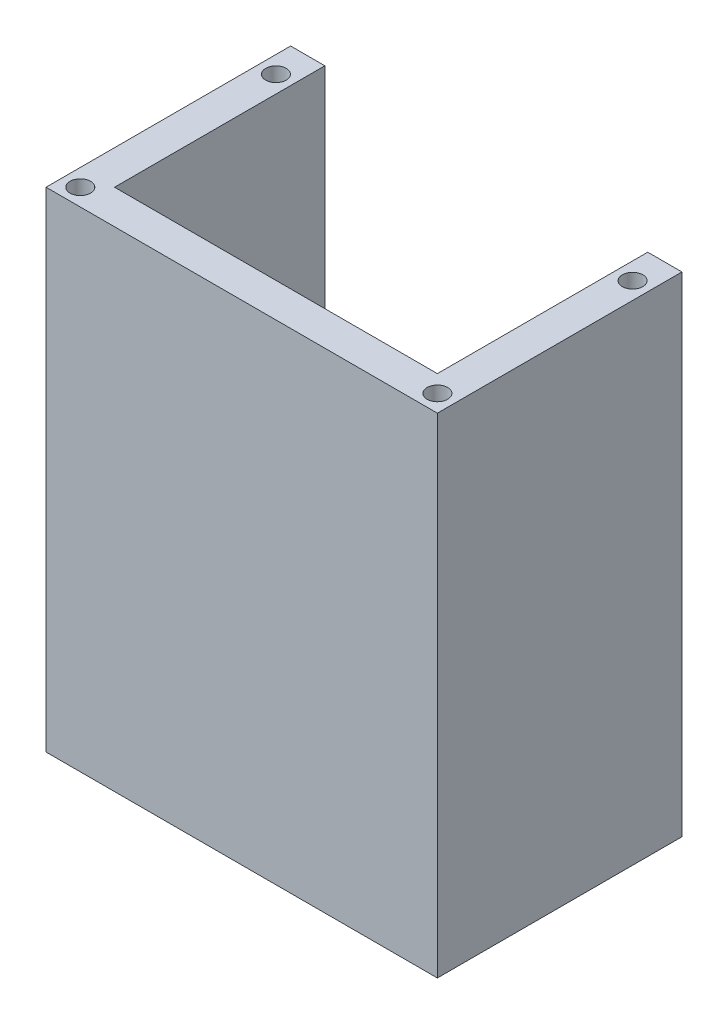
ISO-10303-21;
HEADER;
FILE_DESCRIPTION(('STEP AP214'),'2;1');
FILE_NAME('part.step','',(''),(''),'','','');
FILE_SCHEMA(('AUTOMOTIVE_DESIGN { 1 0 10303 214 1 1 1 1 }'));
ENDSEC;
DATA;
#1=APPLICATION_CONTEXT('core data for automotive mechanical design processes');
#2=APPLICATION_PROTOCOL_DEFINITION('international standard','automotive_design',2000,#1);
#3=PRODUCT_CONTEXT('',#1,'mechanical');
#4=PRODUCT('Part','Part','',(#3));
#5=PRODUCT_RELATED_PRODUCT_CATEGORY('part','',(#4));
#6=PRODUCT_DEFINITION_FORMATION('','',#4);
#7=PRODUCT_DEFINITION_CONTEXT('part definition',#1,'design');
#8=PRODUCT_DEFINITION('design','',#6,#7);
#9=PRODUCT_DEFINITION_SHAPE('','',#8);
#10=(LENGTH_UNIT() NAMED_UNIT(*) SI_UNIT(.MILLI.,.METRE.));
#11=(NAMED_UNIT(*) PLANE_ANGLE_UNIT() SI_UNIT($,.RADIAN.));
#12=(NAMED_UNIT(*) SI_UNIT($,.STERADIAN.) SOLID_ANGLE_UNIT());
#13=UNCERTAINTY_MEASURE_WITH_UNIT(LENGTH_MEASURE(1.E-05),#10,'distance_accuracy_value','');
#14=(GEOMETRIC_REPRESENTATION_CONTEXT(3) GLOBAL_UNCERTAINTY_ASSIGNED_CONTEXT((#13)) GLOBAL_UNIT_ASSIGNED_CONTEXT((#10,
#11,#12)) REPRESENTATION_CONTEXT('',''));
#15=CARTESIAN_POINT('',(0.,0.,0.));
#16=DIRECTION('',(0.,0.,1.));
#17=DIRECTION('',(1.,0.,0.));
#18=AXIS2_PLACEMENT_3D('',#15,#16,#17);
#19=CARTESIAN_POINT('',(0.,100.,-50.));
#20=DIRECTION('',(0.,0.,1.));
#21=DIRECTION('',(1.,0.,0.));
#22=AXIS2_PLACEMENT_3D('',#19,#20,#21);
#23=PLANE('',#22);
#24=DIRECTION('',(0.,1.,0.));
#25=VECTOR('',#24,1.);
#26=CARTESIAN_POINT('',(7.,100.,-50.));
#27=LINE('',#26,#25);
#28=CARTESIAN_POINT('',(7.,0.,-50.));
#29=VERTEX_POINT('',#28);
#30=CARTESIAN_POINT('',(7.,100.,-50.));
#31=VERTEX_POINT('',#30);
#32=EDGE_CURVE('E112',#29,#31,#27,.T.);
#33=ORIENTED_EDGE('',*,*,#32,.F.);
#34=DIRECTION('',(-1.,0.,0.));
#35=VECTOR('',#34,1.);
#36=CARTESIAN_POINT('',(0.,0.,-50.));
#37=LINE('',#36,#35);
#38=CARTESIAN_POINT('',(0.,0.,-50.));
#39=VERTEX_POINT('',#38);
#40=EDGE_CURVE('E78',#29,#39,#37,.T.);
#41=ORIENTED_EDGE('',*,*,#40,.T.);
#42=DIRECTION('',(0.,-1.,0.));
#43=VECTOR('',#42,1.);
#44=CARTESIAN_POINT('',(0.,100.,-50.));
#45=LINE('',#44,#43);
#46=CARTESIAN_POINT('',(0.,100.,-50.));
#47=VERTEX_POINT('',#46);
#48=EDGE_CURVE('E147',#47,#39,#45,.T.);
#49=ORIENTED_EDGE('',*,*,#48,.F.);
#50=DIRECTION('',(-1.,0.,0.));
#51=VECTOR('',#50,1.);
#52=CARTESIAN_POINT('',(0.,100.,-50.));
#53=LINE('',#52,#51);
#54=EDGE_CURVE('E56',#31,#47,#53,.T.);
#55=ORIENTED_EDGE('',*,*,#54,.F.);
#56=EDGE_LOOP('',(#33,#41,#49,#55));
#57=FACE_BOUND('',#56,.T.);
#58=ADVANCED_FACE('F32',(#57),#23,.F.);
#59=DIRECTION('',(0.,-1.,0.));
#60=VECTOR('',#59,1.);
#61=CARTESIAN_POINT('',(73.,100.,-50.));
#62=LINE('',#61,#60);
#63=CARTESIAN_POINT('',(73.,100.,-50.));
#64=VERTEX_POINT('',#63);
#65=CARTESIAN_POINT('',(73.,0.,-50.));
#66=VERTEX_POINT('',#65);
#67=EDGE_CURVE('E47',#64,#66,#62,.T.);
#68=ORIENTED_EDGE('',*,*,#67,.F.);
#69=CARTESIAN_POINT('',(80.,100.,-50.));
#70=VERTEX_POINT('',#69);
#71=EDGE_CURVE('E145',#70,#64,#53,.T.);
#72=ORIENTED_EDGE('',*,*,#71,.F.);
#73=DIRECTION('',(0.,-1.,0.));
#74=VECTOR('',#73,1.);
#75=CARTESIAN_POINT('',(80.,100.,-50.));
#76=LINE('',#75,#74);
#77=CARTESIAN_POINT('',(80.,0.,-50.));
#78=VERTEX_POINT('',#77);
#79=EDGE_CURVE('E157',#70,#78,#76,.T.);
#80=ORIENTED_EDGE('',*,*,#79,.T.);
#81=EDGE_CURVE('E141',#78,#66,#37,.T.);
#82=ORIENTED_EDGE('',*,*,#81,.T.);
#83=EDGE_LOOP('',(#68,#72,#80,#82));
#84=FACE_BOUND('',#83,.T.);
#85=ADVANCED_FACE('F177',(#84),#23,.F.);
#86=CARTESIAN_POINT('',(0.,100.,0.));
#87=DIRECTION('',(0.,-1.,0.));
#88=DIRECTION('',(0.,0.,-1.));
#89=AXIS2_PLACEMENT_3D('',#86,#87,#88);
#90=PLANE('',#89);
#91=CARTESIAN_POINT('',(3.5,100.,-43.5));
#92=DIRECTION('',(0.,1.,0.));
#93=DIRECTION('',(0.,0.,1.));
#94=AXIS2_PLACEMENT_3D('',#91,#92,#93);
#95=CIRCLE('',#94,2.1);
#96=CARTESIAN_POINT('',(3.5,100.,-41.4));
#97=VERTEX_POINT('',#96);
#98=EDGE_CURVE('E215',#97,#97,#95,.T.);
#99=ORIENTED_EDGE('',*,*,#98,.F.);
#100=EDGE_LOOP('',(#99));
#101=FACE_BOUND('',#100,.T.);
#102=CARTESIAN_POINT('',(76.5,100.,-43.4));
#103=DIRECTION('',(0.,1.,0.));
#104=DIRECTION('',(0.,0.,1.));
#105=AXIS2_PLACEMENT_3D('',#102,#103,#104);
#106=CIRCLE('',#105,2.1);
#107=CARTESIAN_POINT('',(76.5,100.,-41.3));
#108=VERTEX_POINT('',#107);
#109=EDGE_CURVE('E226',#108,#108,#106,.T.);
#110=ORIENTED_EDGE('',*,*,#109,.F.);
#111=EDGE_LOOP('',(#110));
#112=FACE_BOUND('',#111,.T.);
#113=CARTESIAN_POINT('',(76.5,100.,-3.5));
#114=DIRECTION('',(0.,1.,0.));
#115=DIRECTION('',(0.,0.,1.));
#116=AXIS2_PLACEMENT_3D('',#113,#114,#115);
#117=CIRCLE('',#116,2.1);
#118=CARTESIAN_POINT('',(76.5,100.,-1.4));
#119=VERTEX_POINT('',#118);
#120=EDGE_CURVE('E222',#119,#119,#117,.T.);
#121=ORIENTED_EDGE('',*,*,#120,.F.);
#122=EDGE_LOOP('',(#121));
#123=FACE_BOUND('',#122,.T.);
#124=CARTESIAN_POINT('',(3.5,100.,-3.5));
#125=DIRECTION('',(0.,1.,0.));
#126=DIRECTION('',(0.,0.,1.));
#127=AXIS2_PLACEMENT_3D('',#124,#125,#126);
#128=CIRCLE('',#127,2.1);
#129=CARTESIAN_POINT('',(3.5,100.,-1.4));
#130=VERTEX_POINT('',#129);
#131=EDGE_CURVE('E133',#130,#130,#128,.T.);
#132=ORIENTED_EDGE('',*,*,#131,.F.);
#133=EDGE_LOOP('',(#132));
#134=FACE_BOUND('',#133,.T.);
#135=DIRECTION('',(0.,0.,1.));
#136=VECTOR('',#135,1.);
#137=CARTESIAN_POINT('',(7.,100.,-7.));
#138=LINE('',#137,#136);
#139=CARTESIAN_POINT('',(7.,100.,-7.));
#140=VERTEX_POINT('',#139);
#141=EDGE_CURVE('E108',#31,#140,#138,.T.);
#142=ORIENTED_EDGE('',*,*,#141,.F.);
#143=ORIENTED_EDGE('',*,*,#54,.T.);
#144=DIRECTION('',(0.,0.,1.));
#145=VECTOR('',#144,1.);
#146=CARTESIAN_POINT('',(0.,100.,0.));
#147=LINE('',#146,#145);
#148=CARTESIAN_POINT('',(0.,100.,0.));
#149=VERTEX_POINT('',#148);
#150=EDGE_CURVE('E139',#47,#149,#147,.T.);
#151=ORIENTED_EDGE('',*,*,#150,.T.);
#152=DIRECTION('',(1.,0.,0.));
#153=VECTOR('',#152,1.);
#154=CARTESIAN_POINT('',(0.,100.,0.));
#155=LINE('',#154,#153);
#156=CARTESIAN_POINT('',(80.,100.,0.));
#157=VERTEX_POINT('',#156);
#158=EDGE_CURVE('E86',#149,#157,#155,.T.);
#159=ORIENTED_EDGE('',*,*,#158,.T.);
#160=DIRECTION('',(0.,0.,-1.));
#161=VECTOR('',#160,1.);
#162=CARTESIAN_POINT('',(80.,100.,0.));
#163=LINE('',#162,#161);
#164=EDGE_CURVE('E143',#157,#70,#163,.T.);
#165=ORIENTED_EDGE('',*,*,#164,.T.);
#166=ORIENTED_EDGE('',*,*,#71,.T.);
#167=DIRECTION('',(0.,0.,-1.));
#168=VECTOR('',#167,1.);
#169=CARTESIAN_POINT('',(73.,100.,-7.));
#170=LINE('',#169,#168);
#171=CARTESIAN_POINT('',(73.,100.,-7.));
#172=VERTEX_POINT('',#171);
#173=EDGE_CURVE('E127',#172,#64,#170,.T.);
#174=ORIENTED_EDGE('',*,*,#173,.F.);
#175=DIRECTION('',(1.,0.,0.));
#176=VECTOR('',#175,1.);
#177=CARTESIAN_POINT('',(7.,100.,-7.));
#178=LINE('',#177,#176);
#179=EDGE_CURVE('E114',#140,#172,#178,.T.);
#180=ORIENTED_EDGE('',*,*,#179,.F.);
#181=EDGE_LOOP('',(#142,#143,#151,#159,#165,#166,#174,#180));
#182=FACE_BOUND('',#181,.T.);
#183=ADVANCED_FACE('F125',(#101,#112,#123,#134,#182),#90,.F.);
#184=CARTESIAN_POINT('',(0.,0.,0.));
#185=DIRECTION('',(0.,-1.,0.));
#186=DIRECTION('',(0.,0.,-1.));
#187=AXIS2_PLACEMENT_3D('',#184,#185,#186);
#188=PLANE('',#187);
#189=CARTESIAN_POINT('',(3.5,0.,-43.5));
#190=DIRECTION('',(0.,1.,0.));
#191=DIRECTION('',(0.,0.,1.));
#192=AXIS2_PLACEMENT_3D('',#189,#190,#191);
#193=CIRCLE('',#192,2.1);
#194=CARTESIAN_POINT('',(3.5,0.,-41.4));
#195=VERTEX_POINT('',#194);
#196=EDGE_CURVE('E202',#195,#195,#193,.T.);
#197=ORIENTED_EDGE('',*,*,#196,.T.);
#198=EDGE_LOOP('',(#197));
#199=FACE_BOUND('',#198,.T.);
#200=CARTESIAN_POINT('',(76.5,0.,-43.4));
#201=DIRECTION('',(0.,1.,0.));
#202=DIRECTION('',(0.,0.,1.));
#203=AXIS2_PLACEMENT_3D('',#200,#201,#202);
#204=CIRCLE('',#203,2.1);
#205=CARTESIAN_POINT('',(76.5,0.,-41.3));
#206=VERTEX_POINT('',#205);
#207=EDGE_CURVE('E206',#206,#206,#204,.T.);
#208=ORIENTED_EDGE('',*,*,#207,.T.);
#209=EDGE_LOOP('',(#208));
#210=FACE_BOUND('',#209,.T.);
#211=CARTESIAN_POINT('',(76.5,0.,-3.5));
#212=DIRECTION('',(0.,1.,0.));
#213=DIRECTION('',(0.,0.,1.));
#214=AXIS2_PLACEMENT_3D('',#211,#212,#213);
#215=CIRCLE('',#214,2.1);
#216=CARTESIAN_POINT('',(76.5,0.,-1.4));
#217=VERTEX_POINT('',#216);
#218=EDGE_CURVE('E210',#217,#217,#215,.T.);
#219=ORIENTED_EDGE('',*,*,#218,.T.);
#220=EDGE_LOOP('',(#219));
#221=FACE_BOUND('',#220,.T.);
#222=CARTESIAN_POINT('',(3.5,0.,-3.5));
#223=DIRECTION('',(0.,1.,0.));
#224=DIRECTION('',(0.,0.,1.));
#225=AXIS2_PLACEMENT_3D('',#222,#223,#224);
#226=CIRCLE('',#225,2.1);
#227=CARTESIAN_POINT('',(3.5,0.,-1.4));
#228=VERTEX_POINT('',#227);
#229=EDGE_CURVE('E213',#228,#228,#226,.T.);
#230=ORIENTED_EDGE('',*,*,#229,.T.);
#231=EDGE_LOOP('',(#230));
#232=FACE_BOUND('',#231,.T.);
#233=ORIENTED_EDGE('',*,*,#40,.F.);
#234=DIRECTION('',(0.,0.,1.));
#235=VECTOR('',#234,1.);
#236=CARTESIAN_POINT('',(7.,0.,0.));
#237=LINE('',#236,#235);
#238=CARTESIAN_POINT('',(7.,0.,-7.));
#239=VERTEX_POINT('',#238);
#240=EDGE_CURVE('E11',#29,#239,#237,.T.);
#241=ORIENTED_EDGE('',*,*,#240,.T.);
#242=DIRECTION('',(1.,0.,0.));
#243=VECTOR('',#242,1.);
#244=CARTESIAN_POINT('',(7.,0.,-7.));
#245=LINE('',#244,#243);
#246=CARTESIAN_POINT('',(73.,0.,-7.));
#247=VERTEX_POINT('',#246);
#248=EDGE_CURVE('E121',#239,#247,#245,.T.);
#249=ORIENTED_EDGE('',*,*,#248,.T.);
#250=DIRECTION('',(0.,0.,-1.));
#251=VECTOR('',#250,1.);
#252=CARTESIAN_POINT('',(73.,0.,-7.));
#253=LINE('',#252,#251);
#254=EDGE_CURVE('E115',#247,#66,#253,.T.);
#255=ORIENTED_EDGE('',*,*,#254,.T.);
#256=ORIENTED_EDGE('',*,*,#81,.F.);
#257=DIRECTION('',(0.,0.,-1.));
#258=VECTOR('',#257,1.);
#259=CARTESIAN_POINT('',(80.,0.,0.));
#260=LINE('',#259,#258);
#261=CARTESIAN_POINT('',(80.,0.,0.));
#262=VERTEX_POINT('',#261);
#263=EDGE_CURVE('E152',#262,#78,#260,.T.);
#264=ORIENTED_EDGE('',*,*,#263,.F.);
#265=DIRECTION('',(1.,0.,0.));
#266=VECTOR('',#265,1.);
#267=CARTESIAN_POINT('',(0.,0.,0.));
#268=LINE('',#267,#266);
#269=CARTESIAN_POINT('',(0.,0.,0.));
#270=VERTEX_POINT('',#269);
#271=EDGE_CURVE('E150',#270,#262,#268,.T.);
#272=ORIENTED_EDGE('',*,*,#271,.F.);
#273=DIRECTION('',(0.,0.,1.));
#274=VECTOR('',#273,1.);
#275=CARTESIAN_POINT('',(0.,0.,0.));
#276=LINE('',#275,#274);
#277=EDGE_CURVE('E138',#39,#270,#276,.T.);
#278=ORIENTED_EDGE('',*,*,#277,.F.);
#279=EDGE_LOOP('',(#233,#241,#249,#255,#256,#264,#272,#278));
#280=FACE_BOUND('',#279,.T.);
#281=ADVANCED_FACE('F168',(#199,#210,#221,#232,#280),#188,.T.);
#282=CARTESIAN_POINT('',(0.,100.,0.));
#283=DIRECTION('',(1.,0.,0.));
#284=DIRECTION('',(0.,0.,-1.));
#285=AXIS2_PLACEMENT_3D('',#282,#283,#284);
#286=PLANE('',#285);
#287=ORIENTED_EDGE('',*,*,#277,.T.);
#288=DIRECTION('',(0.,-1.,0.));
#289=VECTOR('',#288,1.);
#290=CARTESIAN_POINT('',(0.,100.,0.));
#291=LINE('',#290,#289);
#292=EDGE_CURVE('E40',#149,#270,#291,.T.);
#293=ORIENTED_EDGE('',*,*,#292,.F.);
#294=ORIENTED_EDGE('',*,*,#150,.F.);
#295=ORIENTED_EDGE('',*,*,#48,.T.);
#296=EDGE_LOOP('',(#287,#293,#294,#295));
#297=FACE_BOUND('',#296,.T.);
#298=ADVANCED_FACE('F34',(#297),#286,.F.);
#299=CARTESIAN_POINT('',(0.,100.,0.));
#300=DIRECTION('',(0.,0.,-1.));
#301=DIRECTION('',(-1.,0.,0.));
#302=AXIS2_PLACEMENT_3D('',#299,#300,#301);
#303=PLANE('',#302);
#304=ORIENTED_EDGE('',*,*,#271,.T.);
#305=DIRECTION('',(0.,-1.,0.));
#306=VECTOR('',#305,1.);
#307=CARTESIAN_POINT('',(80.,100.,0.));
#308=LINE('',#307,#306);
#309=EDGE_CURVE('E160',#157,#262,#308,.T.);
#310=ORIENTED_EDGE('',*,*,#309,.F.);
#311=ORIENTED_EDGE('',*,*,#158,.F.);
#312=ORIENTED_EDGE('',*,*,#292,.T.);
#313=EDGE_LOOP('',(#304,#310,#311,#312));
#314=FACE_BOUND('',#313,.T.);
#315=ADVANCED_FACE('F163',(#314),#303,.F.);
#316=CARTESIAN_POINT('',(80.,100.,0.));
#317=DIRECTION('',(-1.,0.,0.));
#318=DIRECTION('',(0.,0.,1.));
#319=AXIS2_PLACEMENT_3D('',#316,#317,#318);
#320=PLANE('',#319);
#321=ORIENTED_EDGE('',*,*,#263,.T.);
#322=ORIENTED_EDGE('',*,*,#79,.F.);
#323=ORIENTED_EDGE('',*,*,#164,.F.);
#324=ORIENTED_EDGE('',*,*,#309,.T.);
#325=EDGE_LOOP('',(#321,#322,#323,#324));
#326=FACE_BOUND('',#325,.T.);
#327=ADVANCED_FACE('F173',(#326),#320,.F.);
#328=CARTESIAN_POINT('',(7.,100.,-7.));
#329=DIRECTION('',(1.,0.,0.));
#330=DIRECTION('',(0.,0.,-1.));
#331=AXIS2_PLACEMENT_3D('',#328,#329,#330);
#332=PLANE('',#331);
#333=ORIENTED_EDGE('',*,*,#32,.T.);
#334=ORIENTED_EDGE('',*,*,#141,.T.);
#335=DIRECTION('',(0.,-1.,0.));
#336=VECTOR('',#335,1.);
#337=CARTESIAN_POINT('',(7.,100.,-7.));
#338=LINE('',#337,#336);
#339=EDGE_CURVE('E111',#140,#239,#338,.T.);
#340=ORIENTED_EDGE('',*,*,#339,.T.);
#341=ORIENTED_EDGE('',*,*,#240,.F.);
#342=EDGE_LOOP('',(#333,#334,#340,#341));
#343=FACE_BOUND('',#342,.T.);
#344=ADVANCED_FACE('F110',(#343),#332,.T.);
#345=CARTESIAN_POINT('',(73.,100.,-7.));
#346=DIRECTION('',(-1.,0.,0.));
#347=DIRECTION('',(0.,0.,1.));
#348=AXIS2_PLACEMENT_3D('',#345,#346,#347);
#349=PLANE('',#348);
#350=ORIENTED_EDGE('',*,*,#67,.T.);
#351=ORIENTED_EDGE('',*,*,#254,.F.);
#352=DIRECTION('',(0.,-1.,0.));
#353=VECTOR('',#352,1.);
#354=CARTESIAN_POINT('',(73.,100.,-7.));
#355=LINE('',#354,#353);
#356=EDGE_CURVE('E122',#172,#247,#355,.T.);
#357=ORIENTED_EDGE('',*,*,#356,.F.);
#358=ORIENTED_EDGE('',*,*,#173,.T.);
#359=EDGE_LOOP('',(#350,#351,#357,#358));
#360=FACE_BOUND('',#359,.T.);
#361=ADVANCED_FACE('F249',(#360),#349,.T.);
#362=CARTESIAN_POINT('',(7.,100.,-7.));
#363=DIRECTION('',(0.,0.,-1.));
#364=DIRECTION('',(-1.,0.,0.));
#365=AXIS2_PLACEMENT_3D('',#362,#363,#364);
#366=PLANE('',#365);
#367=ORIENTED_EDGE('',*,*,#248,.F.);
#368=ORIENTED_EDGE('',*,*,#339,.F.);
#369=ORIENTED_EDGE('',*,*,#179,.T.);
#370=ORIENTED_EDGE('',*,*,#356,.T.);
#371=EDGE_LOOP('',(#367,#368,#369,#370));
#372=FACE_BOUND('',#371,.T.);
#373=ADVANCED_FACE('F118',(#372),#366,.T.);
#374=CARTESIAN_POINT('',(3.5,100.,-3.5));
#375=DIRECTION('',(0.,-1.,0.));
#376=DIRECTION('',(0.,0.,-1.));
#377=AXIS2_PLACEMENT_3D('',#374,#375,#376);
#378=CYLINDRICAL_SURFACE('',#377,2.1);
#379=ORIENTED_EDGE('',*,*,#131,.T.);
#380=EDGE_LOOP('',(#379));
#381=FACE_BOUND('',#380,.T.);
#382=ORIENTED_EDGE('',*,*,#229,.F.);
#383=EDGE_LOOP('',(#382));
#384=FACE_BOUND('',#383,.T.);
#385=ADVANCED_FACE('F239',(#381,#384),#378,.F.);
#386=CARTESIAN_POINT('',(76.5,100.,-3.5));
#387=DIRECTION('',(0.,-1.,0.));
#388=DIRECTION('',(0.,0.,-1.));
#389=AXIS2_PLACEMENT_3D('',#386,#387,#388);
#390=CYLINDRICAL_SURFACE('',#389,2.1);
#391=ORIENTED_EDGE('',*,*,#120,.T.);
#392=EDGE_LOOP('',(#391));
#393=FACE_BOUND('',#392,.T.);
#394=ORIENTED_EDGE('',*,*,#218,.F.);
#395=EDGE_LOOP('',(#394));
#396=FACE_BOUND('',#395,.T.);
#397=ADVANCED_FACE('F241',(#393,#396),#390,.F.);
#398=CARTESIAN_POINT('',(76.5,100.,-43.4));
#399=DIRECTION('',(0.,-1.,0.));
#400=DIRECTION('',(0.,0.,-1.));
#401=AXIS2_PLACEMENT_3D('',#398,#399,#400);
#402=CYLINDRICAL_SURFACE('',#401,2.1);
#403=ORIENTED_EDGE('',*,*,#109,.T.);
#404=EDGE_LOOP('',(#403));
#405=FACE_BOUND('',#404,.T.);
#406=ORIENTED_EDGE('',*,*,#207,.F.);
#407=EDGE_LOOP('',(#406));
#408=FACE_BOUND('',#407,.T.);
#409=ADVANCED_FACE('F231',(#405,#408),#402,.F.);
#410=CARTESIAN_POINT('',(3.5,100.,-43.5));
#411=DIRECTION('',(0.,-1.,0.));
#412=DIRECTION('',(0.,0.,-1.));
#413=AXIS2_PLACEMENT_3D('',#410,#411,#412);
#414=CYLINDRICAL_SURFACE('',#413,2.1);
#415=ORIENTED_EDGE('',*,*,#98,.T.);
#416=EDGE_LOOP('',(#415));
#417=FACE_BOUND('',#416,.T.);
#418=ORIENTED_EDGE('',*,*,#196,.F.);
#419=EDGE_LOOP('',(#418));
#420=FACE_BOUND('',#419,.T.);
#421=ADVANCED_FACE('F299',(#417,#420),#414,.F.);
#422=CLOSED_SHELL('',(#58,#85,#183,#281,#298,#315,#327,#344,#361,#373,#385,#397,#409,#421));
#423=MANIFOLD_SOLID_BREP('B2',#422);
#424=ADVANCED_BREP_SHAPE_REPRESENTATION('',(#18,#423),#14);
#425=SHAPE_DEFINITION_REPRESENTATION(#9,#424);
ENDSEC;
END-ISO-10303-21;
